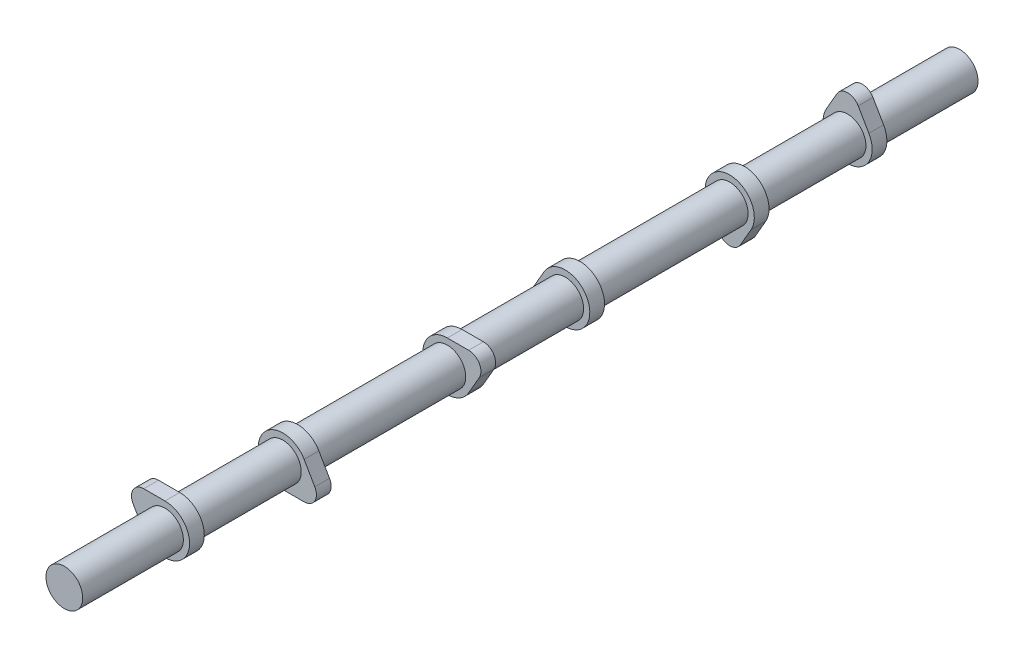
ISO-10303-21;
HEADER;
FILE_DESCRIPTION(('STEP AP214'),'2;1');
FILE_NAME('part.step','',(''),(''),'','','');
FILE_SCHEMA(('AUTOMOTIVE_DESIGN { 1 0 10303 214 1 1 1 1 }'));
ENDSEC;
DATA;
#1=APPLICATION_CONTEXT('core data for automotive mechanical design processes');
#2=APPLICATION_PROTOCOL_DEFINITION('international standard','automotive_design',2000,#1);
#3=PRODUCT_CONTEXT('',#1,'mechanical');
#4=PRODUCT('Part','Part','',(#3));
#5=PRODUCT_RELATED_PRODUCT_CATEGORY('part','',(#4));
#6=PRODUCT_DEFINITION_FORMATION('','',#4);
#7=PRODUCT_DEFINITION_CONTEXT('part definition',#1,'design');
#8=PRODUCT_DEFINITION('design','',#6,#7);
#9=PRODUCT_DEFINITION_SHAPE('','',#8);
#10=(LENGTH_UNIT() NAMED_UNIT(*) SI_UNIT(.MILLI.,.METRE.));
#11=(NAMED_UNIT(*) PLANE_ANGLE_UNIT() SI_UNIT($,.RADIAN.));
#12=(NAMED_UNIT(*) SI_UNIT($,.STERADIAN.) SOLID_ANGLE_UNIT());
#13=UNCERTAINTY_MEASURE_WITH_UNIT(LENGTH_MEASURE(1.E-05),#10,'distance_accuracy_value','');
#14=(GEOMETRIC_REPRESENTATION_CONTEXT(3) GLOBAL_UNCERTAINTY_ASSIGNED_CONTEXT((#13)) GLOBAL_UNIT_ASSIGNED_CONTEXT((#10,
#11,#12)) REPRESENTATION_CONTEXT('',''));
#15=CARTESIAN_POINT('',(0.,0.,0.));
#16=DIRECTION('',(0.,0.,1.));
#17=DIRECTION('',(1.,0.,0.));
#18=AXIS2_PLACEMENT_3D('',#15,#16,#17);
#19=CARTESIAN_POINT('',(0.,-12.7,68.58));
#20=DIRECTION('',(0.,0.,-1.));
#21=DIRECTION('',(1.,0.,0.));
#22=AXIS2_PLACEMENT_3D('',#19,#20,#21);
#23=CYLINDRICAL_SURFACE('',#22,6.35);
#24=CARTESIAN_POINT('',(0.,-12.7,60.96));
#25=DIRECTION('',(0.,0.,1.));
#26=DIRECTION('',(-1.,0.,0.));
#27=AXIS2_PLACEMENT_3D('',#24,#25,#26);
#28=CIRCLE('',#27,6.35);
#29=CARTESIAN_POINT('',(-5.4992613140313,-15.875,60.96));
#30=VERTEX_POINT('',#29);
#31=CARTESIAN_POINT('',(5.49926131403107,-15.875,60.96));
#32=VERTEX_POINT('',#31);
#33=EDGE_CURVE('E390',#30,#32,#28,.T.);
#34=ORIENTED_EDGE('',*,*,#33,.T.);
#35=DIRECTION('',(0.,0.,-1.));
#36=VECTOR('',#35,1.);
#37=CARTESIAN_POINT('',(5.49926131403107,-15.875,68.58));
#38=LINE('',#37,#36);
#39=CARTESIAN_POINT('',(5.49926131403107,-15.875,68.58));
#40=VERTEX_POINT('',#39);
#41=EDGE_CURVE('E409',#40,#32,#38,.T.);
#42=ORIENTED_EDGE('',*,*,#41,.F.);
#43=CARTESIAN_POINT('',(0.,-12.7,68.58));
#44=DIRECTION('',(0.,0.,1.));
#45=DIRECTION('',(-1.,0.,0.));
#46=AXIS2_PLACEMENT_3D('',#43,#44,#45);
#47=CIRCLE('',#46,6.35);
#48=CARTESIAN_POINT('',(-5.4992613140313,-15.875,68.58));
#49=VERTEX_POINT('',#48);
#50=EDGE_CURVE('E391',#49,#40,#47,.T.);
#51=ORIENTED_EDGE('',*,*,#50,.F.);
#52=DIRECTION('',(0.,0.,-1.));
#53=VECTOR('',#52,1.);
#54=CARTESIAN_POINT('',(-5.4992613140313,-15.875,68.58));
#55=LINE('',#54,#53);
#56=EDGE_CURVE('E397',#49,#30,#55,.T.);
#57=ORIENTED_EDGE('',*,*,#56,.T.);
#58=EDGE_LOOP('',(#34,#42,#51,#57));
#59=FACE_BOUND('',#58,.T.);
#60=ADVANCED_FACE('F35',(#59),#23,.T.);
#61=CARTESIAN_POINT('',(5.49926131403107,-15.875,68.58));
#62=DIRECTION('',(-0.866025403784435,0.500000000000006,0.));
#63=DIRECTION('',(-0.500000000000006,-0.866025403784435,0.));
#64=AXIS2_PLACEMENT_3D('',#61,#62,#63);
#65=PLANE('',#64);
#66=DIRECTION('',(0.500000000000006,0.866025403784435,0.));
#67=VECTOR('',#66,1.);
#68=CARTESIAN_POINT('',(5.49926131403107,-15.875,60.96));
#69=LINE('',#68,#67);
#70=CARTESIAN_POINT('',(10.9985226280623,-6.35000000000008,60.96));
#71=VERTEX_POINT('',#70);
#72=EDGE_CURVE('E400',#32,#71,#69,.T.);
#73=ORIENTED_EDGE('',*,*,#72,.T.);
#74=DIRECTION('',(0.,0.,-1.));
#75=VECTOR('',#74,1.);
#76=CARTESIAN_POINT('',(10.9985226280623,-6.35000000000008,68.58));
#77=LINE('',#76,#75);
#78=CARTESIAN_POINT('',(10.9985226280623,-6.35000000000008,68.58));
#79=VERTEX_POINT('',#78);
#80=EDGE_CURVE('E407',#79,#71,#77,.T.);
#81=ORIENTED_EDGE('',*,*,#80,.F.);
#82=DIRECTION('',(0.500000000000006,0.866025403784435,0.));
#83=VECTOR('',#82,1.);
#84=CARTESIAN_POINT('',(5.49926131403107,-15.875,68.58));
#85=LINE('',#84,#83);
#86=EDGE_CURVE('E84',#40,#79,#85,.T.);
#87=ORIENTED_EDGE('',*,*,#86,.F.);
#88=ORIENTED_EDGE('',*,*,#41,.T.);
#89=EDGE_LOOP('',(#73,#81,#87,#88));
#90=FACE_BOUND('',#89,.T.);
#91=ADVANCED_FACE('F428',(#90),#65,.F.);
#92=CARTESIAN_POINT('',(0.,0.,68.58));
#93=DIRECTION('',(0.,0.,-1.));
#94=DIRECTION('',(1.,0.,0.));
#95=AXIS2_PLACEMENT_3D('',#92,#93,#94);
#96=CYLINDRICAL_SURFACE('',#95,12.7);
#97=CARTESIAN_POINT('',(0.,0.,60.96));
#98=DIRECTION('',(0.,0.,1.));
#99=DIRECTION('',(-1.,0.,0.));
#100=AXIS2_PLACEMENT_3D('',#97,#98,#99);
#101=CIRCLE('',#100,12.7);
#102=CARTESIAN_POINT('',(-10.9985226280624,-6.34999999999992,60.96));
#103=VERTEX_POINT('',#102);
#104=EDGE_CURVE('E70',#71,#103,#101,.T.);
#105=ORIENTED_EDGE('',*,*,#104,.T.);
#106=DIRECTION('',(0.,0.,-1.));
#107=VECTOR('',#106,1.);
#108=CARTESIAN_POINT('',(-10.9985226280624,-6.34999999999992,68.58));
#109=LINE('',#108,#107);
#110=CARTESIAN_POINT('',(-10.9985226280624,-6.34999999999992,68.58));
#111=VERTEX_POINT('',#110);
#112=EDGE_CURVE('E405',#111,#103,#109,.T.);
#113=ORIENTED_EDGE('',*,*,#112,.F.);
#114=CARTESIAN_POINT('',(0.,0.,68.58));
#115=DIRECTION('',(0.,0.,1.));
#116=DIRECTION('',(-1.,0.,0.));
#117=AXIS2_PLACEMENT_3D('',#114,#115,#116);
#118=CIRCLE('',#117,12.7);
#119=EDGE_CURVE('E394',#79,#111,#118,.T.);
#120=ORIENTED_EDGE('',*,*,#119,.F.);
#121=ORIENTED_EDGE('',*,*,#80,.T.);
#122=EDGE_LOOP('',(#105,#113,#120,#121));
#123=FACE_BOUND('',#122,.T.);
#124=ADVANCED_FACE('F427',(#123),#96,.T.);
#125=CARTESIAN_POINT('',(-5.4992613140313,-15.875,68.58));
#126=DIRECTION('',(0.866025403784442,0.499999999999994,0.));
#127=DIRECTION('',(-0.499999999999994,0.866025403784442,0.));
#128=AXIS2_PLACEMENT_3D('',#125,#126,#127);
#129=PLANE('',#128);
#130=DIRECTION('',(0.499999999999994,-0.866025403784442,0.));
#131=VECTOR('',#130,1.);
#132=CARTESIAN_POINT('',(-5.4992613140313,-15.875,60.96));
#133=LINE('',#132,#131);
#134=EDGE_CURVE('E76',#103,#30,#133,.T.);
#135=ORIENTED_EDGE('',*,*,#134,.T.);
#136=ORIENTED_EDGE('',*,*,#56,.F.);
#137=DIRECTION('',(0.499999999999994,-0.866025403784442,0.));
#138=VECTOR('',#137,1.);
#139=CARTESIAN_POINT('',(-5.4992613140313,-15.875,68.58));
#140=LINE('',#139,#138);
#141=EDGE_CURVE('E52',#111,#49,#140,.T.);
#142=ORIENTED_EDGE('',*,*,#141,.F.);
#143=ORIENTED_EDGE('',*,*,#112,.T.);
#144=EDGE_LOOP('',(#135,#136,#142,#143));
#145=FACE_BOUND('',#144,.T.);
#146=ADVANCED_FACE('F425',(#145),#129,.F.);
#147=CARTESIAN_POINT('',(0.,-12.7,68.58));
#148=DIRECTION('',(0.,0.,1.));
#149=DIRECTION('',(-1.,0.,0.));
#150=AXIS2_PLACEMENT_3D('',#147,#148,#149);
#151=PLANE('',#150);
#152=CARTESIAN_POINT('',(0.,0.,68.58));
#153=DIRECTION('',(0.,0.,1.));
#154=DIRECTION('',(1.,0.,0.));
#155=AXIS2_PLACEMENT_3D('',#152,#153,#154);
#156=CIRCLE('',#155,9.5);
#157=CARTESIAN_POINT('',(9.5,0.,68.58));
#158=VERTEX_POINT('',#157);
#159=EDGE_CURVE('E387',#158,#158,#156,.F.);
#160=ORIENTED_EDGE('',*,*,#159,.T.);
#161=EDGE_LOOP('',(#160));
#162=FACE_BOUND('',#161,.T.);
#163=ORIENTED_EDGE('',*,*,#50,.T.);
#164=ORIENTED_EDGE('',*,*,#86,.T.);
#165=ORIENTED_EDGE('',*,*,#119,.T.);
#166=ORIENTED_EDGE('',*,*,#141,.T.);
#167=EDGE_LOOP('',(#163,#164,#165,#166));
#168=FACE_BOUND('',#167,.T.);
#169=ADVANCED_FACE('F419',(#162,#168),#151,.T.);
#170=CARTESIAN_POINT('',(0.,-12.7,60.96));
#171=DIRECTION('',(0.,0.,1.));
#172=DIRECTION('',(-1.,0.,0.));
#173=AXIS2_PLACEMENT_3D('',#170,#171,#172);
#174=PLANE('',#173);
#175=CARTESIAN_POINT('',(0.,0.,60.96));
#176=DIRECTION('',(0.,0.,1.));
#177=DIRECTION('',(1.,0.,0.));
#178=AXIS2_PLACEMENT_3D('',#175,#176,#177);
#179=CIRCLE('',#178,9.5);
#180=CARTESIAN_POINT('',(9.5,0.,60.96));
#181=VERTEX_POINT('',#180);
#182=EDGE_CURVE('E44',#181,#181,#179,.F.);
#183=ORIENTED_EDGE('',*,*,#182,.F.);
#184=EDGE_LOOP('',(#183));
#185=FACE_BOUND('',#184,.T.);
#186=ORIENTED_EDGE('',*,*,#33,.F.);
#187=ORIENTED_EDGE('',*,*,#134,.F.);
#188=ORIENTED_EDGE('',*,*,#104,.F.);
#189=ORIENTED_EDGE('',*,*,#72,.F.);
#190=EDGE_LOOP('',(#186,#187,#188,#189));
#191=FACE_BOUND('',#190,.T.);
#192=ADVANCED_FACE('F416',(#185,#191),#174,.F.);
#193=CARTESIAN_POINT('',(0.,0.,120.65));
#194=DIRECTION('',(0.,0.,-1.));
#195=DIRECTION('',(-1.,0.,0.));
#196=AXIS2_PLACEMENT_3D('',#193,#194,#195);
#197=CYLINDRICAL_SURFACE('',#196,9.5);
#198=CARTESIAN_POINT('',(0.,0.,7.62));
#199=DIRECTION('',(0.,0.,1.));
#200=DIRECTION('',(1.,0.,0.));
#201=AXIS2_PLACEMENT_3D('',#198,#199,#200);
#202=CIRCLE('',#201,9.5);
#203=CARTESIAN_POINT('',(9.5,0.,7.62));
#204=VERTEX_POINT('',#203);
#205=EDGE_CURVE('E38',#204,#204,#202,.T.);
#206=ORIENTED_EDGE('',*,*,#205,.T.);
#207=EDGE_LOOP('',(#206));
#208=FACE_BOUND('',#207,.T.);
#209=ORIENTED_EDGE('',*,*,#182,.T.);
#210=EDGE_LOOP('',(#209));
#211=FACE_BOUND('',#210,.T.);
#212=ADVANCED_FACE('F414',(#208,#211),#197,.T.);
#213=ORIENTED_EDGE('',*,*,#159,.F.);
#214=EDGE_LOOP('',(#213));
#215=FACE_BOUND('',#214,.T.);
#216=CARTESIAN_POINT('',(0.,0.,146.05));
#217=DIRECTION('',(0.,0.,1.));
#218=DIRECTION('',(-0.500000000000004,0.866025403784436,0.));
#219=AXIS2_PLACEMENT_3D('',#216,#217,#218);
#220=CIRCLE('',#219,9.5);
#221=CARTESIAN_POINT('',(-4.75000000000004,8.22724133595215,146.05));
#222=VERTEX_POINT('',#221);
#223=EDGE_CURVE('E349',#222,#222,#220,.T.);
#224=ORIENTED_EDGE('',*,*,#223,.F.);
#225=EDGE_LOOP('',(#224));
#226=FACE_BOUND('',#225,.T.);
#227=ADVANCED_FACE('F441',(#215,#226),#197,.T.);
#228=CARTESIAN_POINT('',(0.,12.7,7.62));
#229=DIRECTION('',(0.,0.,-1.));
#230=DIRECTION('',(-1.,0.,0.));
#231=AXIS2_PLACEMENT_3D('',#228,#229,#230);
#232=CYLINDRICAL_SURFACE('',#231,6.35);
#233=CARTESIAN_POINT('',(0.,12.7,0.));
#234=DIRECTION('',(0.,0.,1.));
#235=DIRECTION('',(1.,0.,0.));
#236=AXIS2_PLACEMENT_3D('',#233,#234,#235);
#237=CIRCLE('',#236,6.35);
#238=CARTESIAN_POINT('',(5.49926131403118,15.875,0.));
#239=VERTEX_POINT('',#238);
#240=CARTESIAN_POINT('',(-5.49926131403118,15.875,0.));
#241=VERTEX_POINT('',#240);
#242=EDGE_CURVE('E357',#239,#241,#237,.T.);
#243=ORIENTED_EDGE('',*,*,#242,.T.);
#244=DIRECTION('',(0.,0.,-1.));
#245=VECTOR('',#244,1.);
#246=CARTESIAN_POINT('',(-5.49926131403118,15.875,7.62));
#247=LINE('',#246,#245);
#248=CARTESIAN_POINT('',(-5.49926131403118,15.875,7.62));
#249=VERTEX_POINT('',#248);
#250=EDGE_CURVE('E384',#249,#241,#247,.T.);
#251=ORIENTED_EDGE('',*,*,#250,.F.);
#252=CARTESIAN_POINT('',(0.,12.7,7.62));
#253=DIRECTION('',(0.,0.,1.));
#254=DIRECTION('',(1.,0.,0.));
#255=AXIS2_PLACEMENT_3D('',#252,#253,#254);
#256=CIRCLE('',#255,6.35);
#257=CARTESIAN_POINT('',(5.49926131403118,15.875,7.62));
#258=VERTEX_POINT('',#257);
#259=EDGE_CURVE('E358',#258,#249,#256,.T.);
#260=ORIENTED_EDGE('',*,*,#259,.F.);
#261=DIRECTION('',(0.,0.,-1.));
#262=VECTOR('',#261,1.);
#263=CARTESIAN_POINT('',(5.49926131403118,15.875,7.62));
#264=LINE('',#263,#262);
#265=EDGE_CURVE('E368',#258,#239,#264,.T.);
#266=ORIENTED_EDGE('',*,*,#265,.T.);
#267=EDGE_LOOP('',(#243,#251,#260,#266));
#268=FACE_BOUND('',#267,.T.);
#269=ADVANCED_FACE('F444',(#268),#232,.T.);
#270=CARTESIAN_POINT('',(-5.49926131403118,15.875,7.62));
#271=DIRECTION('',(0.866025403784438,-0.5,0.));
#272=DIRECTION('',(0.5,0.866025403784439,0.));
#273=AXIS2_PLACEMENT_3D('',#270,#271,#272);
#274=PLANE('',#273);
#275=DIRECTION('',(-0.5,-0.866025403784439,0.));
#276=VECTOR('',#275,1.);
#277=CARTESIAN_POINT('',(-5.49926131403118,15.875,0.));
#278=LINE('',#277,#276);
#279=CARTESIAN_POINT('',(-10.9985226280624,6.35,0.));
#280=VERTEX_POINT('',#279);
#281=EDGE_CURVE('E371',#241,#280,#278,.T.);
#282=ORIENTED_EDGE('',*,*,#281,.T.);
#283=DIRECTION('',(0.,0.,-1.));
#284=VECTOR('',#283,1.);
#285=CARTESIAN_POINT('',(-10.9985226280624,6.35,7.62));
#286=LINE('',#285,#284);
#287=CARTESIAN_POINT('',(-10.9985226280624,6.35,7.62));
#288=VERTEX_POINT('',#287);
#289=EDGE_CURVE('E381',#288,#280,#286,.T.);
#290=ORIENTED_EDGE('',*,*,#289,.F.);
#291=DIRECTION('',(-0.5,-0.866025403784439,0.));
#292=VECTOR('',#291,1.);
#293=CARTESIAN_POINT('',(-5.49926131403118,15.875,7.62));
#294=LINE('',#293,#292);
#295=EDGE_CURVE('E361',#249,#288,#294,.T.);
#296=ORIENTED_EDGE('',*,*,#295,.F.);
#297=ORIENTED_EDGE('',*,*,#250,.T.);
#298=EDGE_LOOP('',(#282,#290,#296,#297));
#299=FACE_BOUND('',#298,.T.);
#300=ADVANCED_FACE('F449',(#299),#274,.F.);
#301=CARTESIAN_POINT('',(0.,0.,7.62));
#302=DIRECTION('',(0.,0.,-1.));
#303=DIRECTION('',(-1.,0.,0.));
#304=AXIS2_PLACEMENT_3D('',#301,#302,#303);
#305=CYLINDRICAL_SURFACE('',#304,12.7);
#306=CARTESIAN_POINT('',(0.,0.,0.));
#307=DIRECTION('',(0.,0.,1.));
#308=DIRECTION('',(1.,0.,0.));
#309=AXIS2_PLACEMENT_3D('',#306,#307,#308);
#310=CIRCLE('',#309,12.7);
#311=CARTESIAN_POINT('',(10.9985226280624,6.35,0.));
#312=VERTEX_POINT('',#311);
#313=EDGE_CURVE('E373',#280,#312,#310,.T.);
#314=ORIENTED_EDGE('',*,*,#313,.T.);
#315=DIRECTION('',(0.,0.,-1.));
#316=VECTOR('',#315,1.);
#317=CARTESIAN_POINT('',(10.9985226280624,6.35,7.62));
#318=LINE('',#317,#316);
#319=CARTESIAN_POINT('',(10.9985226280624,6.35,7.62));
#320=VERTEX_POINT('',#319);
#321=EDGE_CURVE('E378',#320,#312,#318,.T.);
#322=ORIENTED_EDGE('',*,*,#321,.F.);
#323=CARTESIAN_POINT('',(0.,0.,7.62));
#324=DIRECTION('',(0.,0.,1.));
#325=DIRECTION('',(1.,0.,0.));
#326=AXIS2_PLACEMENT_3D('',#323,#324,#325);
#327=CIRCLE('',#326,12.7);
#328=EDGE_CURVE('E364',#288,#320,#327,.T.);
#329=ORIENTED_EDGE('',*,*,#328,.F.);
#330=ORIENTED_EDGE('',*,*,#289,.T.);
#331=EDGE_LOOP('',(#314,#322,#329,#330));
#332=FACE_BOUND('',#331,.T.);
#333=ADVANCED_FACE('F453',(#332),#305,.T.);
#334=CARTESIAN_POINT('',(5.49926131403118,15.875,7.62));
#335=DIRECTION('',(-0.866025403784439,-0.5,0.));
#336=DIRECTION('',(0.5,-0.866025403784439,0.));
#337=AXIS2_PLACEMENT_3D('',#334,#335,#336);
#338=PLANE('',#337);
#339=DIRECTION('',(-0.5,0.866025403784439,0.));
#340=VECTOR('',#339,1.);
#341=CARTESIAN_POINT('',(5.49926131403118,15.875,0.));
#342=LINE('',#341,#340);
#343=EDGE_CURVE('E362',#312,#239,#342,.T.);
#344=ORIENTED_EDGE('',*,*,#343,.T.);
#345=ORIENTED_EDGE('',*,*,#265,.F.);
#346=DIRECTION('',(-0.5,0.866025403784439,0.));
#347=VECTOR('',#346,1.);
#348=CARTESIAN_POINT('',(5.49926131403118,15.875,7.62));
#349=LINE('',#348,#347);
#350=EDGE_CURVE('E366',#320,#258,#349,.T.);
#351=ORIENTED_EDGE('',*,*,#350,.F.);
#352=ORIENTED_EDGE('',*,*,#321,.T.);
#353=EDGE_LOOP('',(#344,#345,#351,#352));
#354=FACE_BOUND('',#353,.T.);
#355=ADVANCED_FACE('F457',(#354),#338,.F.);
#356=CARTESIAN_POINT('',(0.,12.7,7.62));
#357=DIRECTION('',(0.,0.,1.));
#358=DIRECTION('',(1.,0.,0.));
#359=AXIS2_PLACEMENT_3D('',#356,#357,#358);
#360=PLANE('',#359);
#361=ORIENTED_EDGE('',*,*,#205,.F.);
#362=EDGE_LOOP('',(#361));
#363=FACE_BOUND('',#362,.T.);
#364=ORIENTED_EDGE('',*,*,#259,.T.);
#365=ORIENTED_EDGE('',*,*,#295,.T.);
#366=ORIENTED_EDGE('',*,*,#328,.T.);
#367=ORIENTED_EDGE('',*,*,#350,.T.);
#368=EDGE_LOOP('',(#364,#365,#366,#367));
#369=FACE_BOUND('',#368,.T.);
#370=ADVANCED_FACE('F461',(#363,#369),#360,.T.);
#371=CARTESIAN_POINT('',(0.,12.7,0.));
#372=DIRECTION('',(0.,0.,1.));
#373=DIRECTION('',(1.,0.,0.));
#374=AXIS2_PLACEMENT_3D('',#371,#372,#373);
#375=PLANE('',#374);
#376=CARTESIAN_POINT('',(0.,0.,0.));
#377=DIRECTION('',(0.,0.,1.));
#378=DIRECTION('',(1.,0.,0.));
#379=AXIS2_PLACEMENT_3D('',#376,#377,#378);
#380=CIRCLE('',#379,9.5);
#381=CARTESIAN_POINT('',(9.5,0.,0.));
#382=VERTEX_POINT('',#381);
#383=EDGE_CURVE('E11',#382,#382,#380,.T.);
#384=ORIENTED_EDGE('',*,*,#383,.T.);
#385=EDGE_LOOP('',(#384));
#386=FACE_BOUND('',#385,.T.);
#387=ORIENTED_EDGE('',*,*,#242,.F.);
#388=ORIENTED_EDGE('',*,*,#343,.F.);
#389=ORIENTED_EDGE('',*,*,#313,.F.);
#390=ORIENTED_EDGE('',*,*,#281,.F.);
#391=EDGE_LOOP('',(#387,#388,#389,#390));
#392=FACE_BOUND('',#391,.T.);
#393=ADVANCED_FACE('F463',(#386,#392),#375,.F.);
#394=ORIENTED_EDGE('',*,*,#383,.F.);
#395=EDGE_LOOP('',(#394));
#396=FACE_BOUND('',#395,.T.);
#397=CARTESIAN_POINT('',(0.,0.,-50.34));
#398=DIRECTION('',(0.,0.,-1.));
#399=DIRECTION('',(-1.,0.,0.));
#400=AXIS2_PLACEMENT_3D('',#397,#398,#399);
#401=CIRCLE('',#400,9.5);
#402=CARTESIAN_POINT('',(-9.5,0.,-50.34));
#403=VERTEX_POINT('',#402);
#404=EDGE_CURVE('E352',#403,#403,#401,.T.);
#405=ORIENTED_EDGE('',*,*,#404,.F.);
#406=EDGE_LOOP('',(#405));
#407=FACE_BOUND('',#406,.T.);
#408=ADVANCED_FACE('F446',(#396,#407),#197,.T.);
#409=CARTESIAN_POINT('',(0.,0.,-50.34));
#410=DIRECTION('',(0.,0.,-1.));
#411=DIRECTION('',(-1.,0.,0.));
#412=AXIS2_PLACEMENT_3D('',#409,#410,#411);
#413=PLANE('',#412);
#414=ORIENTED_EDGE('',*,*,#404,.T.);
#415=EDGE_LOOP('',(#414));
#416=FACE_BOUND('',#415,.T.);
#417=ADVANCED_FACE('F470',(#416),#413,.T.);
#418=CARTESIAN_POINT('',(10.9985226280624,6.34999999999997,214.63));
#419=DIRECTION('',(0.,0.,-1.));
#420=DIRECTION('',(-0.499999999999998,0.86602540378444,0.));
#421=AXIS2_PLACEMENT_3D('',#418,#419,#420);
#422=CYLINDRICAL_SURFACE('',#421,6.35);
#423=CARTESIAN_POINT('',(10.9985226280624,6.34999999999997,207.01));
#424=DIRECTION('',(0.,0.,1.));
#425=DIRECTION('',(0.499999999999998,-0.86602540378444,0.));
#426=AXIS2_PLACEMENT_3D('',#423,#424,#425);
#427=CIRCLE('',#426,6.35);
#428=CARTESIAN_POINT('',(16.4977839420936,3.17499999999996,207.01));
#429=VERTEX_POINT('',#428);
#430=CARTESIAN_POINT('',(10.9985226280624,12.7,207.01));
#431=VERTEX_POINT('',#430);
#432=EDGE_CURVE('E316',#429,#431,#427,.T.);
#433=ORIENTED_EDGE('',*,*,#432,.T.);
#434=DIRECTION('',(0.,0.,-1.));
#435=VECTOR('',#434,1.);
#436=CARTESIAN_POINT('',(10.9985226280624,12.7,214.63));
#437=LINE('',#436,#435);
#438=CARTESIAN_POINT('',(10.9985226280624,12.7,214.63));
#439=VERTEX_POINT('',#438);
#440=EDGE_CURVE('E343',#439,#431,#437,.T.);
#441=ORIENTED_EDGE('',*,*,#440,.F.);
#442=CARTESIAN_POINT('',(10.9985226280624,6.34999999999997,214.63));
#443=DIRECTION('',(0.,0.,1.));
#444=DIRECTION('',(0.499999999999998,-0.86602540378444,0.));
#445=AXIS2_PLACEMENT_3D('',#442,#443,#444);
#446=CIRCLE('',#445,6.35);
#447=CARTESIAN_POINT('',(16.4977839420936,3.17499999999996,214.63));
#448=VERTEX_POINT('',#447);
#449=EDGE_CURVE('E317',#448,#439,#446,.T.);
#450=ORIENTED_EDGE('',*,*,#449,.F.);
#451=DIRECTION('',(0.,0.,-1.));
#452=VECTOR('',#451,1.);
#453=CARTESIAN_POINT('',(16.4977839420936,3.17499999999996,214.63));
#454=LINE('',#453,#452);
#455=EDGE_CURVE('E327',#448,#429,#454,.T.);
#456=ORIENTED_EDGE('',*,*,#455,.T.);
#457=EDGE_LOOP('',(#433,#441,#450,#456));
#458=FACE_BOUND('',#457,.T.);
#459=ADVANCED_FACE('F473',(#458),#422,.T.);
#460=CARTESIAN_POINT('',(10.9985226280624,12.7,214.63));
#461=DIRECTION('',(0.,-1.,0.));
#462=DIRECTION('',(1.,0.,0.));
#463=AXIS2_PLACEMENT_3D('',#460,#461,#462);
#464=PLANE('',#463);
#465=DIRECTION('',(-1.,0.,0.));
#466=VECTOR('',#465,1.);
#467=CARTESIAN_POINT('',(10.9985226280624,12.7,207.01));
#468=LINE('',#467,#466);
#469=CARTESIAN_POINT('',(0.,12.7,207.01));
#470=VERTEX_POINT('',#469);
#471=EDGE_CURVE('E330',#431,#470,#468,.T.);
#472=ORIENTED_EDGE('',*,*,#471,.T.);
#473=DIRECTION('',(0.,0.,-1.));
#474=VECTOR('',#473,1.);
#475=CARTESIAN_POINT('',(0.,12.7,214.63));
#476=LINE('',#475,#474);
#477=CARTESIAN_POINT('',(0.,12.7,214.63));
#478=VERTEX_POINT('',#477);
#479=EDGE_CURVE('E340',#478,#470,#476,.T.);
#480=ORIENTED_EDGE('',*,*,#479,.F.);
#481=DIRECTION('',(-1.,0.,0.));
#482=VECTOR('',#481,1.);
#483=CARTESIAN_POINT('',(10.9985226280624,12.7,214.63));
#484=LINE('',#483,#482);
#485=EDGE_CURVE('E320',#439,#478,#484,.T.);
#486=ORIENTED_EDGE('',*,*,#485,.F.);
#487=ORIENTED_EDGE('',*,*,#440,.T.);
#488=EDGE_LOOP('',(#472,#480,#486,#487));
#489=FACE_BOUND('',#488,.T.);
#490=ADVANCED_FACE('F477',(#489),#464,.F.);
#491=CARTESIAN_POINT('',(0.,0.,214.63));
#492=DIRECTION('',(0.,0.,-1.));
#493=DIRECTION('',(-0.499999999999998,0.86602540378444,0.));
#494=AXIS2_PLACEMENT_3D('',#491,#492,#493);
#495=CYLINDRICAL_SURFACE('',#494,12.7);
#496=CARTESIAN_POINT('',(0.,0.,207.01));
#497=DIRECTION('',(0.,0.,1.));
#498=DIRECTION('',(0.499999999999998,-0.86602540378444,0.));
#499=AXIS2_PLACEMENT_3D('',#496,#497,#498);
#500=CIRCLE('',#499,12.7);
#501=CARTESIAN_POINT('',(10.9985226280624,-6.35000000000003,207.01));
#502=VERTEX_POINT('',#501);
#503=EDGE_CURVE('E332',#470,#502,#500,.T.);
#504=ORIENTED_EDGE('',*,*,#503,.T.);
#505=DIRECTION('',(0.,0.,-1.));
#506=VECTOR('',#505,1.);
#507=CARTESIAN_POINT('',(10.9985226280624,-6.35000000000003,214.63));
#508=LINE('',#507,#506);
#509=CARTESIAN_POINT('',(10.9985226280624,-6.35000000000003,214.63));
#510=VERTEX_POINT('',#509);
#511=EDGE_CURVE('E337',#510,#502,#508,.T.);
#512=ORIENTED_EDGE('',*,*,#511,.F.);
#513=CARTESIAN_POINT('',(0.,0.,214.63));
#514=DIRECTION('',(0.,0.,1.));
#515=DIRECTION('',(0.499999999999998,-0.86602540378444,0.));
#516=AXIS2_PLACEMENT_3D('',#513,#514,#515);
#517=CIRCLE('',#516,12.7);
#518=EDGE_CURVE('E323',#478,#510,#517,.T.);
#519=ORIENTED_EDGE('',*,*,#518,.F.);
#520=ORIENTED_EDGE('',*,*,#479,.T.);
#521=EDGE_LOOP('',(#504,#512,#519,#520));
#522=FACE_BOUND('',#521,.T.);
#523=ADVANCED_FACE('F481',(#522),#495,.T.);
#524=CARTESIAN_POINT('',(16.4977839420936,3.17499999999996,214.63));
#525=DIRECTION('',(-0.866025403784438,0.500000000000002,0.));
#526=DIRECTION('',(-0.500000000000002,-0.866025403784438,0.));
#527=AXIS2_PLACEMENT_3D('',#524,#525,#526);
#528=PLANE('',#527);
#529=DIRECTION('',(0.500000000000002,0.866025403784438,0.));
#530=VECTOR('',#529,1.);
#531=CARTESIAN_POINT('',(16.4977839420936,3.17499999999996,207.01));
#532=LINE('',#531,#530);
#533=EDGE_CURVE('E321',#502,#429,#532,.T.);
#534=ORIENTED_EDGE('',*,*,#533,.T.);
#535=ORIENTED_EDGE('',*,*,#455,.F.);
#536=DIRECTION('',(0.500000000000002,0.866025403784438,0.));
#537=VECTOR('',#536,1.);
#538=CARTESIAN_POINT('',(16.4977839420936,3.17499999999996,214.63));
#539=LINE('',#538,#537);
#540=EDGE_CURVE('E325',#510,#448,#539,.T.);
#541=ORIENTED_EDGE('',*,*,#540,.F.);
#542=ORIENTED_EDGE('',*,*,#511,.T.);
#543=EDGE_LOOP('',(#534,#535,#541,#542));
#544=FACE_BOUND('',#543,.T.);
#545=ADVANCED_FACE('F485',(#544),#528,.F.);
#546=CARTESIAN_POINT('',(10.9985226280624,6.34999999999997,214.63));
#547=DIRECTION('',(0.,0.,1.));
#548=DIRECTION('',(0.499999999999998,-0.86602540378444,0.));
#549=AXIS2_PLACEMENT_3D('',#546,#547,#548);
#550=PLANE('',#549);
#551=CARTESIAN_POINT('',(0.,0.,214.63));
#552=DIRECTION('',(0.,0.,1.));
#553=DIRECTION('',(-0.500000000000004,0.866025403784436,0.));
#554=AXIS2_PLACEMENT_3D('',#551,#552,#553);
#555=CIRCLE('',#554,9.5);
#556=CARTESIAN_POINT('',(-4.75000000000004,8.22724133595215,214.63));
#557=VERTEX_POINT('',#556);
#558=EDGE_CURVE('E313',#557,#557,#555,.F.);
#559=ORIENTED_EDGE('',*,*,#558,.T.);
#560=EDGE_LOOP('',(#559));
#561=FACE_BOUND('',#560,.T.);
#562=ORIENTED_EDGE('',*,*,#449,.T.);
#563=ORIENTED_EDGE('',*,*,#485,.T.);
#564=ORIENTED_EDGE('',*,*,#518,.T.);
#565=ORIENTED_EDGE('',*,*,#540,.T.);
#566=EDGE_LOOP('',(#562,#563,#564,#565));
#567=FACE_BOUND('',#566,.T.);
#568=ADVANCED_FACE('F489',(#561,#567),#550,.T.);
#569=CARTESIAN_POINT('',(10.9985226280624,6.34999999999997,207.01));
#570=DIRECTION('',(0.,0.,1.));
#571=DIRECTION('',(0.499999999999998,-0.86602540378444,0.));
#572=AXIS2_PLACEMENT_3D('',#569,#570,#571);
#573=PLANE('',#572);
#574=CARTESIAN_POINT('',(0.,0.,207.01));
#575=DIRECTION('',(0.,0.,1.));
#576=DIRECTION('',(-0.500000000000004,0.866025403784436,0.));
#577=AXIS2_PLACEMENT_3D('',#574,#575,#576);
#578=CIRCLE('',#577,9.5);
#579=CARTESIAN_POINT('',(-4.75000000000004,8.22724133595215,207.01));
#580=VERTEX_POINT('',#579);
#581=EDGE_CURVE('E346',#580,#580,#578,.F.);
#582=ORIENTED_EDGE('',*,*,#581,.F.);
#583=EDGE_LOOP('',(#582));
#584=FACE_BOUND('',#583,.T.);
#585=ORIENTED_EDGE('',*,*,#432,.F.);
#586=ORIENTED_EDGE('',*,*,#533,.F.);
#587=ORIENTED_EDGE('',*,*,#503,.F.);
#588=ORIENTED_EDGE('',*,*,#471,.F.);
#589=EDGE_LOOP('',(#585,#586,#587,#588));
#590=FACE_BOUND('',#589,.T.);
#591=ADVANCED_FACE('F491',(#584,#590),#573,.F.);
#592=CARTESIAN_POINT('',(0.,0.,266.7));
#593=DIRECTION('',(0.,0.,-1.));
#594=DIRECTION('',(0.500000000000004,-0.866025403784436,0.));
#595=AXIS2_PLACEMENT_3D('',#592,#593,#594);
#596=CYLINDRICAL_SURFACE('',#595,9.5);
#597=CARTESIAN_POINT('',(0.,0.,153.67));
#598=DIRECTION('',(0.,0.,1.));
#599=DIRECTION('',(-0.500000000000004,0.866025403784436,0.));
#600=AXIS2_PLACEMENT_3D('',#597,#598,#599);
#601=CIRCLE('',#600,9.5);
#602=CARTESIAN_POINT('',(-4.75000000000004,8.22724133595215,153.67));
#603=VERTEX_POINT('',#602);
#604=EDGE_CURVE('E312',#603,#603,#601,.T.);
#605=ORIENTED_EDGE('',*,*,#604,.T.);
#606=EDGE_LOOP('',(#605));
#607=FACE_BOUND('',#606,.T.);
#608=ORIENTED_EDGE('',*,*,#581,.T.);
#609=EDGE_LOOP('',(#608));
#610=FACE_BOUND('',#609,.T.);
#611=ADVANCED_FACE('F494',(#607,#610),#596,.T.);
#612=ORIENTED_EDGE('',*,*,#558,.F.);
#613=EDGE_LOOP('',(#612));
#614=FACE_BOUND('',#613,.T.);
#615=CARTESIAN_POINT('',(0.,0.,292.1));
#616=DIRECTION('',(0.,0.,1.));
#617=DIRECTION('',(-0.499999999999992,-0.866025403784443,0.));
#618=AXIS2_PLACEMENT_3D('',#615,#616,#617);
#619=CIRCLE('',#618,9.5);
#620=CARTESIAN_POINT('',(-4.74999999999992,-8.22724133595221,292.1));
#621=VERTEX_POINT('',#620);
#622=EDGE_CURVE('E279',#621,#621,#619,.T.);
#623=ORIENTED_EDGE('',*,*,#622,.F.);
#624=EDGE_LOOP('',(#623));
#625=FACE_BOUND('',#624,.T.);
#626=ADVANCED_FACE('F499',(#614,#625),#596,.T.);
#627=CARTESIAN_POINT('',(-10.9985226280623,-6.35000000000005,153.67));
#628=DIRECTION('',(0.,0.,-1.));
#629=DIRECTION('',(0.500000000000004,-0.866025403784436,0.));
#630=AXIS2_PLACEMENT_3D('',#627,#628,#629);
#631=CYLINDRICAL_SURFACE('',#630,6.35);
#632=CARTESIAN_POINT('',(-10.9985226280623,-6.35000000000005,146.05));
#633=DIRECTION('',(0.,0.,1.));
#634=DIRECTION('',(-0.500000000000004,0.866025403784436,0.));
#635=AXIS2_PLACEMENT_3D('',#632,#633,#634);
#636=CIRCLE('',#635,6.35);
#637=CARTESIAN_POINT('',(-16.4977839420935,-3.17500000000008,146.05));
#638=VERTEX_POINT('',#637);
#639=CARTESIAN_POINT('',(-10.9985226280623,-12.7000000000001,146.05));
#640=VERTEX_POINT('',#639);
#641=EDGE_CURVE('E281',#638,#640,#636,.T.);
#642=ORIENTED_EDGE('',*,*,#641,.T.);
#643=DIRECTION('',(0.,0.,-1.));
#644=VECTOR('',#643,1.);
#645=CARTESIAN_POINT('',(-10.9985226280623,-12.7000000000001,153.67));
#646=LINE('',#645,#644);
#647=CARTESIAN_POINT('',(-10.9985226280623,-12.7000000000001,153.67));
#648=VERTEX_POINT('',#647);
#649=EDGE_CURVE('E309',#648,#640,#646,.T.);
#650=ORIENTED_EDGE('',*,*,#649,.F.);
#651=CARTESIAN_POINT('',(-10.9985226280623,-6.35000000000005,153.67));
#652=DIRECTION('',(0.,0.,1.));
#653=DIRECTION('',(-0.500000000000004,0.866025403784436,0.));
#654=AXIS2_PLACEMENT_3D('',#651,#652,#653);
#655=CIRCLE('',#654,6.35);
#656=CARTESIAN_POINT('',(-16.4977839420935,-3.17500000000008,153.67));
#657=VERTEX_POINT('',#656);
#658=EDGE_CURVE('E283',#657,#648,#655,.T.);
#659=ORIENTED_EDGE('',*,*,#658,.F.);
#660=DIRECTION('',(0.,0.,-1.));
#661=VECTOR('',#660,1.);
#662=CARTESIAN_POINT('',(-16.4977839420935,-3.17500000000008,153.67));
#663=LINE('',#662,#661);
#664=EDGE_CURVE('E293',#657,#638,#663,.T.);
#665=ORIENTED_EDGE('',*,*,#664,.T.);
#666=EDGE_LOOP('',(#642,#650,#659,#665));
#667=FACE_BOUND('',#666,.T.);
#668=ADVANCED_FACE('F502',(#667),#631,.T.);
#669=CARTESIAN_POINT('',(-10.9985226280623,-12.7000000000001,153.67));
#670=DIRECTION('',(0.,1.,0.));
#671=DIRECTION('',(-1.,0.,0.));
#672=AXIS2_PLACEMENT_3D('',#669,#670,#671);
#673=PLANE('',#672);
#674=DIRECTION('',(1.,0.,0.));
#675=VECTOR('',#674,1.);
#676=CARTESIAN_POINT('',(-10.9985226280623,-12.7000000000001,146.05));
#677=LINE('',#676,#675);
#678=CARTESIAN_POINT('',(0.,-12.7,146.05));
#679=VERTEX_POINT('',#678);
#680=EDGE_CURVE('E296',#640,#679,#677,.T.);
#681=ORIENTED_EDGE('',*,*,#680,.T.);
#682=DIRECTION('',(0.,0.,-1.));
#683=VECTOR('',#682,1.);
#684=CARTESIAN_POINT('',(0.,-12.7,153.67));
#685=LINE('',#684,#683);
#686=CARTESIAN_POINT('',(0.,-12.7,153.67));
#687=VERTEX_POINT('',#686);
#688=EDGE_CURVE('E306',#687,#679,#685,.T.);
#689=ORIENTED_EDGE('',*,*,#688,.F.);
#690=DIRECTION('',(1.,0.,0.));
#691=VECTOR('',#690,1.);
#692=CARTESIAN_POINT('',(-10.9985226280623,-12.7000000000001,153.67));
#693=LINE('',#692,#691);
#694=EDGE_CURVE('E286',#648,#687,#693,.T.);
#695=ORIENTED_EDGE('',*,*,#694,.F.);
#696=ORIENTED_EDGE('',*,*,#649,.T.);
#697=EDGE_LOOP('',(#681,#689,#695,#696));
#698=FACE_BOUND('',#697,.T.);
#699=ADVANCED_FACE('F506',(#698),#673,.F.);
#700=CARTESIAN_POINT('',(0.,0.,153.67));
#701=DIRECTION('',(0.,0.,-1.));
#702=DIRECTION('',(0.500000000000004,-0.866025403784436,0.));
#703=AXIS2_PLACEMENT_3D('',#700,#701,#702);
#704=CYLINDRICAL_SURFACE('',#703,12.7);
#705=CARTESIAN_POINT('',(0.,0.,146.05));
#706=DIRECTION('',(0.,0.,1.));
#707=DIRECTION('',(-0.500000000000004,0.866025403784436,0.));
#708=AXIS2_PLACEMENT_3D('',#705,#706,#707);
#709=CIRCLE('',#708,12.7);
#710=CARTESIAN_POINT('',(-10.9985226280624,6.34999999999995,146.05));
#711=VERTEX_POINT('',#710);
#712=EDGE_CURVE('E298',#679,#711,#709,.T.);
#713=ORIENTED_EDGE('',*,*,#712,.T.);
#714=DIRECTION('',(0.,0.,-1.));
#715=VECTOR('',#714,1.);
#716=CARTESIAN_POINT('',(-10.9985226280624,6.34999999999995,153.67));
#717=LINE('',#716,#715);
#718=CARTESIAN_POINT('',(-10.9985226280624,6.34999999999995,153.67));
#719=VERTEX_POINT('',#718);
#720=EDGE_CURVE('E303',#719,#711,#717,.T.);
#721=ORIENTED_EDGE('',*,*,#720,.F.);
#722=CARTESIAN_POINT('',(0.,0.,153.67));
#723=DIRECTION('',(0.,0.,1.));
#724=DIRECTION('',(-0.500000000000004,0.866025403784436,0.));
#725=AXIS2_PLACEMENT_3D('',#722,#723,#724);
#726=CIRCLE('',#725,12.7);
#727=EDGE_CURVE('E289',#687,#719,#726,.T.);
#728=ORIENTED_EDGE('',*,*,#727,.F.);
#729=ORIENTED_EDGE('',*,*,#688,.T.);
#730=EDGE_LOOP('',(#713,#721,#728,#729));
#731=FACE_BOUND('',#730,.T.);
#732=ADVANCED_FACE('F510',(#731),#704,.T.);
#733=CARTESIAN_POINT('',(-16.4977839420935,-3.17500000000008,153.67));
#734=DIRECTION('',(0.866025403784441,-0.499999999999996,0.));
#735=DIRECTION('',(0.499999999999996,0.866025403784441,0.));
#736=AXIS2_PLACEMENT_3D('',#733,#734,#735);
#737=PLANE('',#736);
#738=DIRECTION('',(-0.499999999999996,-0.866025403784441,0.));
#739=VECTOR('',#738,1.);
#740=CARTESIAN_POINT('',(-16.4977839420935,-3.17500000000008,146.05));
#741=LINE('',#740,#739);
#742=EDGE_CURVE('E287',#711,#638,#741,.T.);
#743=ORIENTED_EDGE('',*,*,#742,.T.);
#744=ORIENTED_EDGE('',*,*,#664,.F.);
#745=DIRECTION('',(-0.499999999999996,-0.866025403784441,0.));
#746=VECTOR('',#745,1.);
#747=CARTESIAN_POINT('',(-16.4977839420935,-3.17500000000008,153.67));
#748=LINE('',#747,#746);
#749=EDGE_CURVE('E291',#719,#657,#748,.T.);
#750=ORIENTED_EDGE('',*,*,#749,.F.);
#751=ORIENTED_EDGE('',*,*,#720,.T.);
#752=EDGE_LOOP('',(#743,#744,#750,#751));
#753=FACE_BOUND('',#752,.T.);
#754=ADVANCED_FACE('F514',(#753),#737,.F.);
#755=CARTESIAN_POINT('',(-10.9985226280623,-6.35000000000005,153.67));
#756=DIRECTION('',(0.,0.,1.));
#757=DIRECTION('',(-0.500000000000004,0.866025403784436,0.));
#758=AXIS2_PLACEMENT_3D('',#755,#756,#757);
#759=PLANE('',#758);
#760=ORIENTED_EDGE('',*,*,#604,.F.);
#761=EDGE_LOOP('',(#760));
#762=FACE_BOUND('',#761,.T.);
#763=ORIENTED_EDGE('',*,*,#658,.T.);
#764=ORIENTED_EDGE('',*,*,#694,.T.);
#765=ORIENTED_EDGE('',*,*,#727,.T.);
#766=ORIENTED_EDGE('',*,*,#749,.T.);
#767=EDGE_LOOP('',(#763,#764,#765,#766));
#768=FACE_BOUND('',#767,.T.);
#769=ADVANCED_FACE('F518',(#762,#768),#759,.T.);
#770=CARTESIAN_POINT('',(-10.9985226280623,-6.35000000000005,146.05));
#771=DIRECTION('',(0.,0.,1.));
#772=DIRECTION('',(-0.500000000000004,0.866025403784436,0.));
#773=AXIS2_PLACEMENT_3D('',#770,#771,#772);
#774=PLANE('',#773);
#775=ORIENTED_EDGE('',*,*,#223,.T.);
#776=EDGE_LOOP('',(#775));
#777=FACE_BOUND('',#776,.T.);
#778=ORIENTED_EDGE('',*,*,#641,.F.);
#779=ORIENTED_EDGE('',*,*,#742,.F.);
#780=ORIENTED_EDGE('',*,*,#712,.F.);
#781=ORIENTED_EDGE('',*,*,#680,.F.);
#782=EDGE_LOOP('',(#778,#779,#780,#781));
#783=FACE_BOUND('',#782,.T.);
#784=ADVANCED_FACE('F520',(#777,#783),#774,.F.);
#785=CARTESIAN_POINT('',(-10.9985226280624,6.34999999999997,360.68));
#786=DIRECTION('',(0.,0.,-1.));
#787=DIRECTION('',(-0.499999999999998,-0.86602540378444,0.));
#788=AXIS2_PLACEMENT_3D('',#785,#786,#787);
#789=CYLINDRICAL_SURFACE('',#788,6.35);
#790=CARTESIAN_POINT('',(-10.9985226280624,6.34999999999997,353.06));
#791=DIRECTION('',(0.,0.,1.));
#792=DIRECTION('',(0.499999999999998,0.86602540378444,0.));
#793=AXIS2_PLACEMENT_3D('',#790,#791,#792);
#794=CIRCLE('',#793,6.35);
#795=CARTESIAN_POINT('',(-10.9985226280624,12.7,353.06));
#796=VERTEX_POINT('',#795);
#797=CARTESIAN_POINT('',(-16.4977839420936,3.17499999999996,353.06));
#798=VERTEX_POINT('',#797);
#799=EDGE_CURVE('E246',#796,#798,#794,.T.);
#800=ORIENTED_EDGE('',*,*,#799,.T.);
#801=DIRECTION('',(0.,0.,-1.));
#802=VECTOR('',#801,1.);
#803=CARTESIAN_POINT('',(-16.4977839420936,3.17499999999996,360.68));
#804=LINE('',#803,#802);
#805=CARTESIAN_POINT('',(-16.4977839420936,3.17499999999996,360.68));
#806=VERTEX_POINT('',#805);
#807=EDGE_CURVE('E273',#806,#798,#804,.T.);
#808=ORIENTED_EDGE('',*,*,#807,.F.);
#809=CARTESIAN_POINT('',(-10.9985226280624,6.34999999999997,360.68));
#810=DIRECTION('',(0.,0.,1.));
#811=DIRECTION('',(0.499999999999998,0.86602540378444,0.));
#812=AXIS2_PLACEMENT_3D('',#809,#810,#811);
#813=CIRCLE('',#812,6.35);
#814=CARTESIAN_POINT('',(-10.9985226280624,12.7,360.68));
#815=VERTEX_POINT('',#814);
#816=EDGE_CURVE('E247',#815,#806,#813,.T.);
#817=ORIENTED_EDGE('',*,*,#816,.F.);
#818=DIRECTION('',(0.,0.,-1.));
#819=VECTOR('',#818,1.);
#820=CARTESIAN_POINT('',(-10.9985226280624,12.7,360.68));
#821=LINE('',#820,#819);
#822=EDGE_CURVE('E257',#815,#796,#821,.T.);
#823=ORIENTED_EDGE('',*,*,#822,.T.);
#824=EDGE_LOOP('',(#800,#808,#817,#823));
#825=FACE_BOUND('',#824,.T.);
#826=ADVANCED_FACE('F523',(#825),#789,.T.);
#827=CARTESIAN_POINT('',(-16.4977839420936,3.17499999999996,360.68));
#828=DIRECTION('',(0.866025403784437,0.500000000000002,0.));
#829=DIRECTION('',(-0.500000000000002,0.866025403784437,0.));
#830=AXIS2_PLACEMENT_3D('',#827,#828,#829);
#831=PLANE('',#830);
#832=DIRECTION('',(0.500000000000002,-0.866025403784437,0.));
#833=VECTOR('',#832,1.);
#834=CARTESIAN_POINT('',(-16.4977839420936,3.17499999999996,353.06));
#835=LINE('',#834,#833);
#836=CARTESIAN_POINT('',(-10.9985226280624,-6.35000000000003,353.06));
#837=VERTEX_POINT('',#836);
#838=EDGE_CURVE('E260',#798,#837,#835,.T.);
#839=ORIENTED_EDGE('',*,*,#838,.T.);
#840=DIRECTION('',(0.,0.,-1.));
#841=VECTOR('',#840,1.);
#842=CARTESIAN_POINT('',(-10.9985226280624,-6.35000000000003,360.68));
#843=LINE('',#842,#841);
#844=CARTESIAN_POINT('',(-10.9985226280624,-6.35000000000003,360.68));
#845=VERTEX_POINT('',#844);
#846=EDGE_CURVE('E270',#845,#837,#843,.T.);
#847=ORIENTED_EDGE('',*,*,#846,.F.);
#848=DIRECTION('',(0.500000000000002,-0.866025403784437,0.));
#849=VECTOR('',#848,1.);
#850=CARTESIAN_POINT('',(-16.4977839420936,3.17499999999996,360.68));
#851=LINE('',#850,#849);
#852=EDGE_CURVE('E250',#806,#845,#851,.T.);
#853=ORIENTED_EDGE('',*,*,#852,.F.);
#854=ORIENTED_EDGE('',*,*,#807,.T.);
#855=EDGE_LOOP('',(#839,#847,#853,#854));
#856=FACE_BOUND('',#855,.T.);
#857=ADVANCED_FACE('F530',(#856),#831,.F.);
#858=CARTESIAN_POINT('',(0.,0.,360.68));
#859=DIRECTION('',(0.,0.,-1.));
#860=DIRECTION('',(-0.499999999999998,-0.86602540378444,0.));
#861=AXIS2_PLACEMENT_3D('',#858,#859,#860);
#862=CYLINDRICAL_SURFACE('',#861,12.7);
#863=CARTESIAN_POINT('',(0.,0.,353.06));
#864=DIRECTION('',(0.,0.,1.));
#865=DIRECTION('',(0.499999999999998,0.86602540378444,0.));
#866=AXIS2_PLACEMENT_3D('',#863,#864,#865);
#867=CIRCLE('',#866,12.7);
#868=CARTESIAN_POINT('',(0.,12.7,353.06));
#869=VERTEX_POINT('',#868);
#870=EDGE_CURVE('E262',#837,#869,#867,.T.);
#871=ORIENTED_EDGE('',*,*,#870,.T.);
#872=DIRECTION('',(0.,0.,-1.));
#873=VECTOR('',#872,1.);
#874=CARTESIAN_POINT('',(0.,12.7,360.68));
#875=LINE('',#874,#873);
#876=CARTESIAN_POINT('',(0.,12.7,360.68));
#877=VERTEX_POINT('',#876);
#878=EDGE_CURVE('E267',#877,#869,#875,.T.);
#879=ORIENTED_EDGE('',*,*,#878,.F.);
#880=CARTESIAN_POINT('',(0.,0.,360.68));
#881=DIRECTION('',(0.,0.,1.));
#882=DIRECTION('',(0.499999999999998,0.86602540378444,0.));
#883=AXIS2_PLACEMENT_3D('',#880,#881,#882);
#884=CIRCLE('',#883,12.7);
#885=EDGE_CURVE('E253',#845,#877,#884,.T.);
#886=ORIENTED_EDGE('',*,*,#885,.F.);
#887=ORIENTED_EDGE('',*,*,#846,.T.);
#888=EDGE_LOOP('',(#871,#879,#886,#887));
#889=FACE_BOUND('',#888,.T.);
#890=ADVANCED_FACE('F534',(#889),#862,.T.);
#891=CARTESIAN_POINT('',(-10.9985226280624,12.7,360.68));
#892=DIRECTION('',(0.,-1.,0.));
#893=DIRECTION('',(1.,0.,0.));
#894=AXIS2_PLACEMENT_3D('',#891,#892,#893);
#895=PLANE('',#894);
#896=DIRECTION('',(-1.,0.,0.));
#897=VECTOR('',#896,1.);
#898=CARTESIAN_POINT('',(-10.9985226280624,12.7,353.06));
#899=LINE('',#898,#897);
#900=EDGE_CURVE('E251',#869,#796,#899,.T.);
#901=ORIENTED_EDGE('',*,*,#900,.T.);
#902=ORIENTED_EDGE('',*,*,#822,.F.);
#903=DIRECTION('',(-1.,0.,0.));
#904=VECTOR('',#903,1.);
#905=CARTESIAN_POINT('',(-10.9985226280624,12.7,360.68));
#906=LINE('',#905,#904);
#907=EDGE_CURVE('E255',#877,#815,#906,.T.);
#908=ORIENTED_EDGE('',*,*,#907,.F.);
#909=ORIENTED_EDGE('',*,*,#878,.T.);
#910=EDGE_LOOP('',(#901,#902,#908,#909));
#911=FACE_BOUND('',#910,.T.);
#912=ADVANCED_FACE('F538',(#911),#895,.F.);
#913=CARTESIAN_POINT('',(-10.9985226280624,6.34999999999997,360.68));
#914=DIRECTION('',(0.,0.,1.));
#915=DIRECTION('',(0.499999999999998,0.86602540378444,0.));
#916=AXIS2_PLACEMENT_3D('',#913,#914,#915);
#917=PLANE('',#916);
#918=CARTESIAN_POINT('',(0.,0.,360.68));
#919=DIRECTION('',(0.,0.,1.));
#920=DIRECTION('',(-0.499999999999992,-0.866025403784443,0.));
#921=AXIS2_PLACEMENT_3D('',#918,#919,#920);
#922=CIRCLE('',#921,9.5);
#923=CARTESIAN_POINT('',(-4.74999999999992,-8.22724133595221,360.68));
#924=VERTEX_POINT('',#923);
#925=EDGE_CURVE('E243',#924,#924,#922,.F.);
#926=ORIENTED_EDGE('',*,*,#925,.T.);
#927=EDGE_LOOP('',(#926));
#928=FACE_BOUND('',#927,.T.);
#929=ORIENTED_EDGE('',*,*,#816,.T.);
#930=ORIENTED_EDGE('',*,*,#852,.T.);
#931=ORIENTED_EDGE('',*,*,#885,.T.);
#932=ORIENTED_EDGE('',*,*,#907,.T.);
#933=EDGE_LOOP('',(#929,#930,#931,#932));
#934=FACE_BOUND('',#933,.T.);
#935=ADVANCED_FACE('F542',(#928,#934),#917,.T.);
#936=CARTESIAN_POINT('',(-10.9985226280624,6.34999999999997,353.06));
#937=DIRECTION('',(0.,0.,1.));
#938=DIRECTION('',(0.499999999999998,0.86602540378444,0.));
#939=AXIS2_PLACEMENT_3D('',#936,#937,#938);
#940=PLANE('',#939);
#941=CARTESIAN_POINT('',(0.,0.,353.06));
#942=DIRECTION('',(0.,0.,1.));
#943=DIRECTION('',(-0.499999999999992,-0.866025403784443,0.));
#944=AXIS2_PLACEMENT_3D('',#941,#942,#943);
#945=CIRCLE('',#944,9.5);
#946=CARTESIAN_POINT('',(-4.74999999999992,-8.22724133595221,353.06));
#947=VERTEX_POINT('',#946);
#948=EDGE_CURVE('E276',#947,#947,#945,.F.);
#949=ORIENTED_EDGE('',*,*,#948,.F.);
#950=EDGE_LOOP('',(#949));
#951=FACE_BOUND('',#950,.T.);
#952=ORIENTED_EDGE('',*,*,#799,.F.);
#953=ORIENTED_EDGE('',*,*,#900,.F.);
#954=ORIENTED_EDGE('',*,*,#870,.F.);
#955=ORIENTED_EDGE('',*,*,#838,.F.);
#956=EDGE_LOOP('',(#952,#953,#954,#955));
#957=FACE_BOUND('',#956,.T.);
#958=ADVANCED_FACE('F544',(#951,#957),#940,.F.);
#959=CARTESIAN_POINT('',(0.,0.,412.75));
#960=DIRECTION('',(0.,0.,-1.));
#961=DIRECTION('',(0.499999999999992,0.866025403784443,0.));
#962=AXIS2_PLACEMENT_3D('',#959,#960,#961);
#963=CYLINDRICAL_SURFACE('',#962,9.5);
#964=CARTESIAN_POINT('',(0.,0.,299.72));
#965=DIRECTION('',(0.,0.,1.));
#966=DIRECTION('',(-0.499999999999992,-0.866025403784443,0.));
#967=AXIS2_PLACEMENT_3D('',#964,#965,#966);
#968=CIRCLE('',#967,9.5);
#969=CARTESIAN_POINT('',(-4.74999999999992,-8.22724133595221,299.72));
#970=VERTEX_POINT('',#969);
#971=EDGE_CURVE('E232',#970,#970,#968,.T.);
#972=ORIENTED_EDGE('',*,*,#971,.T.);
#973=EDGE_LOOP('',(#972));
#974=FACE_BOUND('',#973,.T.);
#975=ORIENTED_EDGE('',*,*,#948,.T.);
#976=EDGE_LOOP('',(#975));
#977=FACE_BOUND('',#976,.T.);
#978=ADVANCED_FACE('F547',(#974,#977),#963,.T.);
#979=ORIENTED_EDGE('',*,*,#925,.F.);
#980=EDGE_LOOP('',(#979));
#981=FACE_BOUND('',#980,.T.);
#982=CARTESIAN_POINT('',(0.,0.,412.75));
#983=DIRECTION('',(0.,0.,1.));
#984=DIRECTION('',(-0.499999999999992,-0.866025403784443,0.));
#985=AXIS2_PLACEMENT_3D('',#982,#983,#984);
#986=CIRCLE('',#985,9.5);
#987=CARTESIAN_POINT('',(-4.74999999999992,-8.22724133595221,412.75));
#988=VERTEX_POINT('',#987);
#989=EDGE_CURVE('E235',#988,#988,#986,.T.);
#990=ORIENTED_EDGE('',*,*,#989,.F.);
#991=EDGE_LOOP('',(#990));
#992=FACE_BOUND('',#991,.T.);
#993=ADVANCED_FACE('F552',(#981,#992),#963,.T.);
#994=CARTESIAN_POINT('',(0.,0.,412.75));
#995=DIRECTION('',(0.,0.,1.));
#996=DIRECTION('',(-0.499999999999992,-0.866025403784443,0.));
#997=AXIS2_PLACEMENT_3D('',#994,#995,#996);
#998=PLANE('',#997);
#999=ORIENTED_EDGE('',*,*,#989,.T.);
#1000=EDGE_LOOP('',(#999));
#1001=FACE_BOUND('',#1000,.T.);
#1002=ADVANCED_FACE('F555',(#1001),#998,.T.);
#1003=CARTESIAN_POINT('',(10.9985226280624,-6.3499999999999,299.72));
#1004=DIRECTION('',(0.,0.,-1.));
#1005=DIRECTION('',(0.499999999999992,0.866025403784443,0.));
#1006=AXIS2_PLACEMENT_3D('',#1003,#1004,#1005);
#1007=CYLINDRICAL_SURFACE('',#1006,6.35);
#1008=CARTESIAN_POINT('',(10.9985226280624,-6.3499999999999,292.1));
#1009=DIRECTION('',(0.,0.,1.));
#1010=DIRECTION('',(-0.499999999999992,-0.866025403784443,0.));
#1011=AXIS2_PLACEMENT_3D('',#1008,#1009,#1010);
#1012=CIRCLE('',#1011,6.35);
#1013=CARTESIAN_POINT('',(10.9985226280625,-12.6999999999999,292.1));
#1014=VERTEX_POINT('',#1013);
#1015=CARTESIAN_POINT('',(16.4977839420936,-3.17499999999985,292.1));
#1016=VERTEX_POINT('',#1015);
#1017=EDGE_CURVE('E231',#1014,#1016,#1012,.T.);
#1018=ORIENTED_EDGE('',*,*,#1017,.T.);
#1019=DIRECTION('',(0.,0.,-1.));
#1020=VECTOR('',#1019,1.);
#1021=CARTESIAN_POINT('',(16.4977839420936,-3.17499999999985,299.72));
#1022=LINE('',#1021,#1020);
#1023=CARTESIAN_POINT('',(16.4977839420936,-3.17499999999985,299.72));
#1024=VERTEX_POINT('',#1023);
#1025=EDGE_CURVE('E211',#1024,#1016,#1022,.T.);
#1026=ORIENTED_EDGE('',*,*,#1025,.F.);
#1027=CARTESIAN_POINT('',(10.9985226280624,-6.3499999999999,299.72));
#1028=DIRECTION('',(0.,0.,1.));
#1029=DIRECTION('',(-0.499999999999992,-0.866025403784443,0.));
#1030=AXIS2_PLACEMENT_3D('',#1027,#1028,#1029);
#1031=CIRCLE('',#1030,6.35);
#1032=CARTESIAN_POINT('',(10.9985226280625,-12.6999999999999,299.72));
#1033=VERTEX_POINT('',#1032);
#1034=EDGE_CURVE('E218',#1033,#1024,#1031,.T.);
#1035=ORIENTED_EDGE('',*,*,#1034,.F.);
#1036=DIRECTION('',(0.,0.,-1.));
#1037=VECTOR('',#1036,1.);
#1038=CARTESIAN_POINT('',(10.9985226280625,-12.6999999999999,299.72));
#1039=LINE('',#1038,#1037);
#1040=EDGE_CURVE('E965',#1033,#1014,#1039,.T.);
#1041=ORIENTED_EDGE('',*,*,#1040,.T.);
#1042=EDGE_LOOP('',(#1018,#1026,#1035,#1041));
#1043=FACE_BOUND('',#1042,.T.);
#1044=ADVANCED_FACE('F229',(#1043),#1007,.T.);
#1045=CARTESIAN_POINT('',(16.4977839420936,-3.17499999999985,299.72));
#1046=DIRECTION('',(-0.866025403784434,-0.500000000000008,0.));
#1047=DIRECTION('',(0.500000000000008,-0.866025403784434,0.));
#1048=AXIS2_PLACEMENT_3D('',#1045,#1046,#1047);
#1049=PLANE('',#1048);
#1050=DIRECTION('',(-0.500000000000008,0.866025403784434,0.));
#1051=VECTOR('',#1050,1.);
#1052=CARTESIAN_POINT('',(16.4977839420936,-3.17499999999985,292.1));
#1053=LINE('',#1052,#1051);
#1054=CARTESIAN_POINT('',(10.9985226280623,6.3500000000001,292.1));
#1055=VERTEX_POINT('',#1054);
#1056=EDGE_CURVE('E956',#1016,#1055,#1053,.T.);
#1057=ORIENTED_EDGE('',*,*,#1056,.T.);
#1058=DIRECTION('',(0.,0.,-1.));
#1059=VECTOR('',#1058,1.);
#1060=CARTESIAN_POINT('',(10.9985226280623,6.3500000000001,299.72));
#1061=LINE('',#1060,#1059);
#1062=CARTESIAN_POINT('',(10.9985226280623,6.3500000000001,299.72));
#1063=VERTEX_POINT('',#1062);
#1064=EDGE_CURVE('E214',#1063,#1055,#1061,.T.);
#1065=ORIENTED_EDGE('',*,*,#1064,.F.);
#1066=DIRECTION('',(-0.500000000000008,0.866025403784434,0.));
#1067=VECTOR('',#1066,1.);
#1068=CARTESIAN_POINT('',(16.4977839420936,-3.17499999999985,299.72));
#1069=LINE('',#1068,#1067);
#1070=EDGE_CURVE('E207',#1024,#1063,#1069,.T.);
#1071=ORIENTED_EDGE('',*,*,#1070,.F.);
#1072=ORIENTED_EDGE('',*,*,#1025,.T.);
#1073=EDGE_LOOP('',(#1057,#1065,#1071,#1072));
#1074=FACE_BOUND('',#1073,.T.);
#1075=ADVANCED_FACE('F209',(#1074),#1049,.F.);
#1076=CARTESIAN_POINT('',(0.,0.,299.72));
#1077=DIRECTION('',(0.,0.,-1.));
#1078=DIRECTION('',(0.499999999999992,0.866025403784443,0.));
#1079=AXIS2_PLACEMENT_3D('',#1076,#1077,#1078);
#1080=CYLINDRICAL_SURFACE('',#1079,12.7);
#1081=CARTESIAN_POINT('',(0.,0.,292.1));
#1082=DIRECTION('',(0.,0.,1.));
#1083=DIRECTION('',(-0.499999999999992,-0.866025403784443,0.));
#1084=AXIS2_PLACEMENT_3D('',#1081,#1082,#1083);
#1085=CIRCLE('',#1084,12.7);
#1086=CARTESIAN_POINT('',(1.17961196366423E-13,-12.7,292.1));
#1087=VERTEX_POINT('',#1086);
#1088=EDGE_CURVE('E958',#1055,#1087,#1085,.T.);
#1089=ORIENTED_EDGE('',*,*,#1088,.T.);
#1090=DIRECTION('',(0.,0.,-1.));
#1091=VECTOR('',#1090,1.);
#1092=CARTESIAN_POINT('',(1.17961196366423E-13,-12.7,299.72));
#1093=LINE('',#1092,#1091);
#1094=CARTESIAN_POINT('',(1.17961196366423E-13,-12.7,299.72));
#1095=VERTEX_POINT('',#1094);
#1096=EDGE_CURVE('E237',#1095,#1087,#1093,.T.);
#1097=ORIENTED_EDGE('',*,*,#1096,.F.);
#1098=CARTESIAN_POINT('',(0.,0.,299.72));
#1099=DIRECTION('',(0.,0.,1.));
#1100=DIRECTION('',(-0.499999999999992,-0.866025403784443,0.));
#1101=AXIS2_PLACEMENT_3D('',#1098,#1099,#1100);
#1102=CIRCLE('',#1101,12.7);
#1103=EDGE_CURVE('E217',#1063,#1095,#1102,.T.);
#1104=ORIENTED_EDGE('',*,*,#1103,.F.);
#1105=ORIENTED_EDGE('',*,*,#1064,.T.);
#1106=EDGE_LOOP('',(#1089,#1097,#1104,#1105));
#1107=FACE_BOUND('',#1106,.T.);
#1108=ADVANCED_FACE('F564',(#1107),#1080,.T.);
#1109=CARTESIAN_POINT('',(10.9985226280625,-12.6999999999999,299.72));
#1110=DIRECTION('',(0.,1.,0.));
#1111=DIRECTION('',(-1.,0.,0.));
#1112=AXIS2_PLACEMENT_3D('',#1109,#1110,#1111);
#1113=PLANE('',#1112);
#1114=DIRECTION('',(1.,0.,0.));
#1115=VECTOR('',#1114,1.);
#1116=CARTESIAN_POINT('',(10.9985226280625,-12.6999999999999,292.1));
#1117=LINE('',#1116,#1115);
#1118=EDGE_CURVE('E227',#1087,#1014,#1117,.T.);
#1119=ORIENTED_EDGE('',*,*,#1118,.T.);
#1120=ORIENTED_EDGE('',*,*,#1040,.F.);
#1121=DIRECTION('',(1.,0.,0.));
#1122=VECTOR('',#1121,1.);
#1123=CARTESIAN_POINT('',(10.9985226280625,-12.6999999999999,299.72));
#1124=LINE('',#1123,#1122);
#1125=EDGE_CURVE('E223',#1095,#1033,#1124,.T.);
#1126=ORIENTED_EDGE('',*,*,#1125,.F.);
#1127=ORIENTED_EDGE('',*,*,#1096,.T.);
#1128=EDGE_LOOP('',(#1119,#1120,#1126,#1127));
#1129=FACE_BOUND('',#1128,.T.);
#1130=ADVANCED_FACE('F567',(#1129),#1113,.F.);
#1131=CARTESIAN_POINT('',(10.9985226280624,-6.3499999999999,299.72));
#1132=DIRECTION('',(0.,0.,1.));
#1133=DIRECTION('',(-0.499999999999992,-0.866025403784443,0.));
#1134=AXIS2_PLACEMENT_3D('',#1131,#1132,#1133);
#1135=PLANE('',#1134);
#1136=ORIENTED_EDGE('',*,*,#971,.F.);
#1137=EDGE_LOOP('',(#1136));
#1138=FACE_BOUND('',#1137,.T.);
#1139=ORIENTED_EDGE('',*,*,#1034,.T.);
#1140=ORIENTED_EDGE('',*,*,#1070,.T.);
#1141=ORIENTED_EDGE('',*,*,#1103,.T.);
#1142=ORIENTED_EDGE('',*,*,#1125,.T.);
#1143=EDGE_LOOP('',(#1139,#1140,#1141,#1142));
#1144=FACE_BOUND('',#1143,.T.);
#1145=ADVANCED_FACE('F221',(#1138,#1144),#1135,.T.);
#1146=CARTESIAN_POINT('',(10.9985226280624,-6.3499999999999,292.1));
#1147=DIRECTION('',(0.,0.,1.));
#1148=DIRECTION('',(-0.499999999999992,-0.866025403784443,0.));
#1149=AXIS2_PLACEMENT_3D('',#1146,#1147,#1148);
#1150=PLANE('',#1149);
#1151=ORIENTED_EDGE('',*,*,#622,.T.);
#1152=EDGE_LOOP('',(#1151));
#1153=FACE_BOUND('',#1152,.T.);
#1154=ORIENTED_EDGE('',*,*,#1017,.F.);
#1155=ORIENTED_EDGE('',*,*,#1118,.F.);
#1156=ORIENTED_EDGE('',*,*,#1088,.F.);
#1157=ORIENTED_EDGE('',*,*,#1056,.F.);
#1158=EDGE_LOOP('',(#1154,#1155,#1156,#1157));
#1159=FACE_BOUND('',#1158,.T.);
#1160=ADVANCED_FACE('F572',(#1153,#1159),#1150,.F.);
#1161=CLOSED_SHELL('',(#60,#91,#124,#146,#169,#192,#212,#227,#269,#300,#333,#355,#370,#393,#408,
#417,#459,#490,#523,#545,#568,#591,#611,#626,#668,#699,#732,#754,#769,#784,#826,#857,#890,#912,
#935,#958,#978,#993,#1002,#1044,#1075,#1108,#1130,#1145,#1160));
#1162=MANIFOLD_SOLID_BREP('B2',#1161);
#1163=ADVANCED_BREP_SHAPE_REPRESENTATION('',(#18,#1162),#14);
#1164=SHAPE_DEFINITION_REPRESENTATION(#9,#1163);
ENDSEC;
END-ISO-10303-21;
